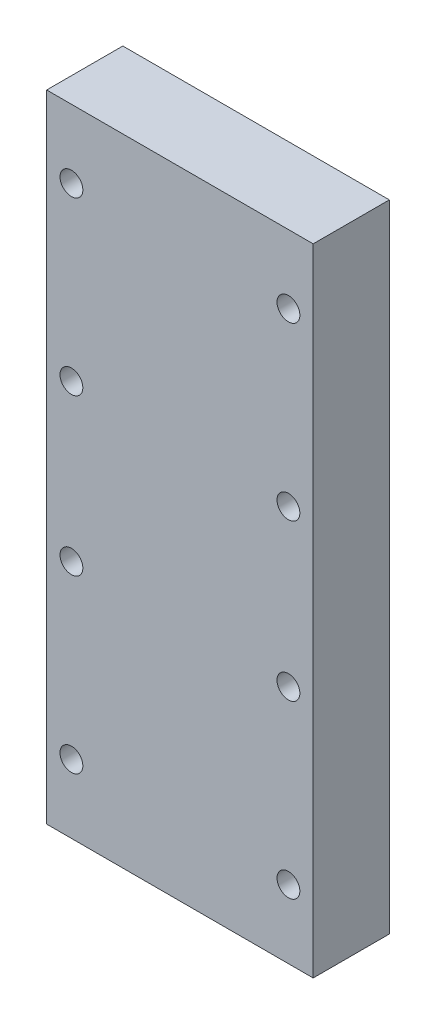
ISO-10303-21;
HEADER;
FILE_DESCRIPTION(('STEP AP214'),'2;1');
FILE_NAME('part.step','',(''),(''),'','','');
FILE_SCHEMA(('AUTOMOTIVE_DESIGN { 1 0 10303 214 1 1 1 1 }'));
ENDSEC;
DATA;
#1=APPLICATION_CONTEXT('core data for automotive mechanical design processes');
#2=APPLICATION_PROTOCOL_DEFINITION('international standard','automotive_design',2000,#1);
#3=PRODUCT_CONTEXT('',#1,'mechanical');
#4=PRODUCT('Part','Part','',(#3));
#5=PRODUCT_RELATED_PRODUCT_CATEGORY('part','',(#4));
#6=PRODUCT_DEFINITION_FORMATION('','',#4);
#7=PRODUCT_DEFINITION_CONTEXT('part definition',#1,'design');
#8=PRODUCT_DEFINITION('design','',#6,#7);
#9=PRODUCT_DEFINITION_SHAPE('','',#8);
#10=(LENGTH_UNIT() NAMED_UNIT(*) SI_UNIT(.MILLI.,.METRE.));
#11=(NAMED_UNIT(*) PLANE_ANGLE_UNIT() SI_UNIT($,.RADIAN.));
#12=(NAMED_UNIT(*) SI_UNIT($,.STERADIAN.) SOLID_ANGLE_UNIT());
#13=UNCERTAINTY_MEASURE_WITH_UNIT(LENGTH_MEASURE(1.E-05),#10,'distance_accuracy_value','');
#14=(GEOMETRIC_REPRESENTATION_CONTEXT(3) GLOBAL_UNCERTAINTY_ASSIGNED_CONTEXT((#13)) GLOBAL_UNIT_ASSIGNED_CONTEXT((#10,
#11,#12)) REPRESENTATION_CONTEXT('',''));
#15=CARTESIAN_POINT('',(0.,0.,0.));
#16=DIRECTION('',(0.,0.,1.));
#17=DIRECTION('',(1.,0.,0.));
#18=AXIS2_PLACEMENT_3D('',#15,#16,#17);
#19=CARTESIAN_POINT('',(-35.,-83.5,20.));
#20=DIRECTION('',(1.,0.,0.));
#21=DIRECTION('',(0.,0.,-1.));
#22=AXIS2_PLACEMENT_3D('',#19,#20,#21);
#23=PLANE('',#22);
#24=DIRECTION('',(0.,-1.,0.));
#25=VECTOR('',#24,1.);
#26=CARTESIAN_POINT('',(-35.,-83.5,0.));
#27=LINE('',#26,#25);
#28=CARTESIAN_POINT('',(-35.,83.5,0.));
#29=VERTEX_POINT('',#28);
#30=CARTESIAN_POINT('',(-35.,-83.5,0.));
#31=VERTEX_POINT('',#30);
#32=EDGE_CURVE('E96',#29,#31,#27,.T.);
#33=ORIENTED_EDGE('',*,*,#32,.T.);
#34=DIRECTION('',(0.,0.,-1.));
#35=VECTOR('',#34,1.);
#36=CARTESIAN_POINT('',(-35.,-83.5,20.));
#37=LINE('',#36,#35);
#38=CARTESIAN_POINT('',(-35.,-83.5,20.));
#39=VERTEX_POINT('',#38);
#40=EDGE_CURVE('E11',#39,#31,#37,.T.);
#41=ORIENTED_EDGE('',*,*,#40,.F.);
#42=DIRECTION('',(0.,-1.,0.));
#43=VECTOR('',#42,1.);
#44=CARTESIAN_POINT('',(-35.,-83.5,20.));
#45=LINE('',#44,#43);
#46=CARTESIAN_POINT('',(-35.,83.5,20.));
#47=VERTEX_POINT('',#46);
#48=EDGE_CURVE('E84',#47,#39,#45,.T.);
#49=ORIENTED_EDGE('',*,*,#48,.F.);
#50=DIRECTION('',(0.,0.,-1.));
#51=VECTOR('',#50,1.);
#52=CARTESIAN_POINT('',(-35.,83.5,20.));
#53=LINE('',#52,#51);
#54=EDGE_CURVE('E92',#47,#29,#53,.T.);
#55=ORIENTED_EDGE('',*,*,#54,.T.);
#56=EDGE_LOOP('',(#33,#41,#49,#55));
#57=FACE_BOUND('',#56,.T.);
#58=ADVANCED_FACE('F33',(#57),#23,.F.);
#59=CARTESIAN_POINT('',(35.,-83.5,20.));
#60=DIRECTION('',(0.,1.,0.));
#61=DIRECTION('',(0.,0.,1.));
#62=AXIS2_PLACEMENT_3D('',#59,#60,#61);
#63=PLANE('',#62);
#64=DIRECTION('',(1.,0.,0.));
#65=VECTOR('',#64,1.);
#66=CARTESIAN_POINT('',(35.,-83.5,0.));
#67=LINE('',#66,#65);
#68=CARTESIAN_POINT('',(35.,-83.5,0.));
#69=VERTEX_POINT('',#68);
#70=EDGE_CURVE('E88',#31,#69,#67,.T.);
#71=ORIENTED_EDGE('',*,*,#70,.T.);
#72=DIRECTION('',(0.,0.,-1.));
#73=VECTOR('',#72,1.);
#74=CARTESIAN_POINT('',(35.,-83.5,20.));
#75=LINE('',#74,#73);
#76=CARTESIAN_POINT('',(35.,-83.5,20.));
#77=VERTEX_POINT('',#76);
#78=EDGE_CURVE('E41',#77,#69,#75,.T.);
#79=ORIENTED_EDGE('',*,*,#78,.F.);
#80=DIRECTION('',(1.,0.,0.));
#81=VECTOR('',#80,1.);
#82=CARTESIAN_POINT('',(35.,-83.5,20.));
#83=LINE('',#82,#81);
#84=EDGE_CURVE('E79',#39,#77,#83,.T.);
#85=ORIENTED_EDGE('',*,*,#84,.F.);
#86=ORIENTED_EDGE('',*,*,#40,.T.);
#87=EDGE_LOOP('',(#71,#79,#85,#86));
#88=FACE_BOUND('',#87,.T.);
#89=ADVANCED_FACE('F87',(#88),#63,.F.);
#90=CARTESIAN_POINT('',(35.,-83.5,20.));
#91=DIRECTION('',(-1.,0.,0.));
#92=DIRECTION('',(0.,0.,1.));
#93=AXIS2_PLACEMENT_3D('',#90,#91,#92);
#94=PLANE('',#93);
#95=DIRECTION('',(0.,1.,0.));
#96=VECTOR('',#95,1.);
#97=CARTESIAN_POINT('',(35.,-83.5,0.));
#98=LINE('',#97,#96);
#99=CARTESIAN_POINT('',(35.,83.5,0.));
#100=VERTEX_POINT('',#99);
#101=EDGE_CURVE('E66',#69,#100,#98,.T.);
#102=ORIENTED_EDGE('',*,*,#101,.T.);
#103=DIRECTION('',(0.,0.,-1.));
#104=VECTOR('',#103,1.);
#105=CARTESIAN_POINT('',(35.,83.5,20.));
#106=LINE('',#105,#104);
#107=CARTESIAN_POINT('',(35.,83.5,20.));
#108=VERTEX_POINT('',#107);
#109=EDGE_CURVE('E89',#108,#100,#106,.T.);
#110=ORIENTED_EDGE('',*,*,#109,.F.);
#111=DIRECTION('',(0.,1.,0.));
#112=VECTOR('',#111,1.);
#113=CARTESIAN_POINT('',(35.,-83.5,20.));
#114=LINE('',#113,#112);
#115=EDGE_CURVE('E82',#77,#108,#114,.T.);
#116=ORIENTED_EDGE('',*,*,#115,.F.);
#117=ORIENTED_EDGE('',*,*,#78,.T.);
#118=EDGE_LOOP('',(#102,#110,#116,#117));
#119=FACE_BOUND('',#118,.T.);
#120=ADVANCED_FACE('F90',(#119),#94,.F.);
#121=CARTESIAN_POINT('',(35.,83.5,20.));
#122=DIRECTION('',(0.,-1.,0.));
#123=DIRECTION('',(0.,0.,-1.));
#124=AXIS2_PLACEMENT_3D('',#121,#122,#123);
#125=PLANE('',#124);
#126=DIRECTION('',(-1.,0.,0.));
#127=VECTOR('',#126,1.);
#128=CARTESIAN_POINT('',(35.,83.5,0.));
#129=LINE('',#128,#127);
#130=EDGE_CURVE('E72',#100,#29,#129,.T.);
#131=ORIENTED_EDGE('',*,*,#130,.T.);
#132=ORIENTED_EDGE('',*,*,#54,.F.);
#133=DIRECTION('',(-1.,0.,0.));
#134=VECTOR('',#133,1.);
#135=CARTESIAN_POINT('',(35.,83.5,20.));
#136=LINE('',#135,#134);
#137=EDGE_CURVE('E49',#108,#47,#136,.T.);
#138=ORIENTED_EDGE('',*,*,#137,.F.);
#139=ORIENTED_EDGE('',*,*,#109,.T.);
#140=EDGE_LOOP('',(#131,#132,#138,#139));
#141=FACE_BOUND('',#140,.T.);
#142=ADVANCED_FACE('F104',(#141),#125,.F.);
#143=CARTESIAN_POINT('',(0.,0.,20.));
#144=DIRECTION('',(0.,0.,1.));
#145=DIRECTION('',(1.,0.,0.));
#146=AXIS2_PLACEMENT_3D('',#143,#144,#145);
#147=PLANE('',#146);
#148=CARTESIAN_POINT('',(-28.5000000000696,-65.499999999921,20.));
#149=DIRECTION('',(0.,0.,-1.));
#150=DIRECTION('',(-1.,0.,0.));
#151=AXIS2_PLACEMENT_3D('',#148,#149,#150);
#152=CIRCLE('',#151,2.99999999999999);
#153=CARTESIAN_POINT('',(-31.5000000000696,-65.499999999921,20.));
#154=VERTEX_POINT('',#153);
#155=EDGE_CURVE('E149',#154,#154,#152,.T.);
#156=ORIENTED_EDGE('',*,*,#155,.T.);
#157=EDGE_LOOP('',(#156));
#158=FACE_BOUND('',#157,.T.);
#159=CARTESIAN_POINT('',(28.4999999999304,-65.499999999921,20.));
#160=DIRECTION('',(0.,0.,-1.));
#161=DIRECTION('',(-1.,0.,0.));
#162=AXIS2_PLACEMENT_3D('',#159,#160,#161);
#163=CIRCLE('',#162,2.99999999999999);
#164=CARTESIAN_POINT('',(25.4999999999304,-65.499999999921,20.));
#165=VERTEX_POINT('',#164);
#166=EDGE_CURVE('E143',#165,#165,#163,.T.);
#167=ORIENTED_EDGE('',*,*,#166,.T.);
#168=EDGE_LOOP('',(#167));
#169=FACE_BOUND('',#168,.T.);
#170=CARTESIAN_POINT('',(-28.5000000000691,-20.4999999999208,20.));
#171=DIRECTION('',(0.,0.,-1.));
#172=DIRECTION('',(-1.,0.,0.));
#173=AXIS2_PLACEMENT_3D('',#170,#171,#172);
#174=CIRCLE('',#173,3.);
#175=CARTESIAN_POINT('',(-31.5000000000691,-20.4999999999208,20.));
#176=VERTEX_POINT('',#175);
#177=EDGE_CURVE('E137',#176,#176,#174,.T.);
#178=ORIENTED_EDGE('',*,*,#177,.T.);
#179=EDGE_LOOP('',(#178));
#180=FACE_BOUND('',#179,.T.);
#181=CARTESIAN_POINT('',(28.4999999999308,-20.4999999999215,20.));
#182=DIRECTION('',(0.,0.,-1.));
#183=DIRECTION('',(-1.,0.,0.));
#184=AXIS2_PLACEMENT_3D('',#181,#182,#183);
#185=CIRCLE('',#184,3.);
#186=CARTESIAN_POINT('',(25.4999999999308,-20.4999999999215,20.));
#187=VERTEX_POINT('',#186);
#188=EDGE_CURVE('E131',#187,#187,#185,.T.);
#189=ORIENTED_EDGE('',*,*,#188,.T.);
#190=EDGE_LOOP('',(#189));
#191=FACE_BOUND('',#190,.T.);
#192=CARTESIAN_POINT('',(-28.5000000000496,20.5000000000216,20.));
#193=DIRECTION('',(0.,0.,-1.));
#194=DIRECTION('',(-1.,0.,0.));
#195=AXIS2_PLACEMENT_3D('',#192,#193,#194);
#196=CIRCLE('',#195,3.);
#197=CARTESIAN_POINT('',(-31.5000000000496,20.5000000000216,20.));
#198=VERTEX_POINT('',#197);
#199=EDGE_CURVE('E125',#198,#198,#196,.T.);
#200=ORIENTED_EDGE('',*,*,#199,.T.);
#201=EDGE_LOOP('',(#200));
#202=FACE_BOUND('',#201,.T.);
#203=CARTESIAN_POINT('',(28.4999999999503,20.5000000000216,20.));
#204=DIRECTION('',(0.,0.,-1.));
#205=DIRECTION('',(-1.,0.,0.));
#206=AXIS2_PLACEMENT_3D('',#203,#204,#205);
#207=CIRCLE('',#206,3.);
#208=CARTESIAN_POINT('',(25.4999999999503,20.5000000000216,20.));
#209=VERTEX_POINT('',#208);
#210=EDGE_CURVE('E119',#209,#209,#207,.T.);
#211=ORIENTED_EDGE('',*,*,#210,.T.);
#212=EDGE_LOOP('',(#211));
#213=FACE_BOUND('',#212,.T.);
#214=CARTESIAN_POINT('',(-28.5000000000491,65.5000000000213,20.));
#215=DIRECTION('',(0.,0.,-1.));
#216=DIRECTION('',(-1.,0.,0.));
#217=AXIS2_PLACEMENT_3D('',#214,#215,#216);
#218=CIRCLE('',#217,3.);
#219=CARTESIAN_POINT('',(-31.5000000000492,65.5000000000213,20.));
#220=VERTEX_POINT('',#219);
#221=EDGE_CURVE('E113',#220,#220,#218,.T.);
#222=ORIENTED_EDGE('',*,*,#221,.T.);
#223=EDGE_LOOP('',(#222));
#224=FACE_BOUND('',#223,.T.);
#225=CARTESIAN_POINT('',(28.4999999999508,65.5000000000218,20.));
#226=DIRECTION('',(0.,0.,-1.));
#227=DIRECTION('',(-1.,0.,0.));
#228=AXIS2_PLACEMENT_3D('',#225,#226,#227);
#229=CIRCLE('',#228,3.);
#230=CARTESIAN_POINT('',(25.4999999999508,65.5000000000218,20.));
#231=VERTEX_POINT('',#230);
#232=EDGE_CURVE('E99',#231,#231,#229,.T.);
#233=ORIENTED_EDGE('',*,*,#232,.T.);
#234=EDGE_LOOP('',(#233));
#235=FACE_BOUND('',#234,.T.);
#236=ORIENTED_EDGE('',*,*,#48,.T.);
#237=ORIENTED_EDGE('',*,*,#84,.T.);
#238=ORIENTED_EDGE('',*,*,#115,.T.);
#239=ORIENTED_EDGE('',*,*,#137,.T.);
#240=EDGE_LOOP('',(#236,#237,#238,#239));
#241=FACE_BOUND('',#240,.T.);
#242=ADVANCED_FACE('F80',(#158,#169,#180,#191,#202,#213,#224,#235,#241),#147,.T.);
#243=CARTESIAN_POINT('',(0.,0.,0.));
#244=DIRECTION('',(0.,0.,1.));
#245=DIRECTION('',(1.,0.,0.));
#246=AXIS2_PLACEMENT_3D('',#243,#244,#245);
#247=PLANE('',#246);
#248=CARTESIAN_POINT('',(-28.5000000000696,-65.499999999921,0.));
#249=DIRECTION('',(0.,0.,-1.));
#250=DIRECTION('',(-1.,0.,0.));
#251=AXIS2_PLACEMENT_3D('',#248,#249,#250);
#252=CIRCLE('',#251,2.99999999999999);
#253=CARTESIAN_POINT('',(-31.5000000000696,-65.499999999921,0.));
#254=VERTEX_POINT('',#253);
#255=EDGE_CURVE('E152',#254,#254,#252,.T.);
#256=ORIENTED_EDGE('',*,*,#255,.F.);
#257=EDGE_LOOP('',(#256));
#258=FACE_BOUND('',#257,.T.);
#259=CARTESIAN_POINT('',(28.4999999999304,-65.499999999921,0.));
#260=DIRECTION('',(0.,0.,-1.));
#261=DIRECTION('',(-1.,0.,0.));
#262=AXIS2_PLACEMENT_3D('',#259,#260,#261);
#263=CIRCLE('',#262,2.99999999999999);
#264=CARTESIAN_POINT('',(25.4999999999304,-65.499999999921,0.));
#265=VERTEX_POINT('',#264);
#266=EDGE_CURVE('E146',#265,#265,#263,.T.);
#267=ORIENTED_EDGE('',*,*,#266,.F.);
#268=EDGE_LOOP('',(#267));
#269=FACE_BOUND('',#268,.T.);
#270=CARTESIAN_POINT('',(-28.5000000000691,-20.4999999999208,0.));
#271=DIRECTION('',(0.,0.,-1.));
#272=DIRECTION('',(-1.,0.,0.));
#273=AXIS2_PLACEMENT_3D('',#270,#271,#272);
#274=CIRCLE('',#273,3.);
#275=CARTESIAN_POINT('',(-31.5000000000691,-20.4999999999208,0.));
#276=VERTEX_POINT('',#275);
#277=EDGE_CURVE('E140',#276,#276,#274,.T.);
#278=ORIENTED_EDGE('',*,*,#277,.F.);
#279=EDGE_LOOP('',(#278));
#280=FACE_BOUND('',#279,.T.);
#281=CARTESIAN_POINT('',(28.4999999999308,-20.4999999999215,0.));
#282=DIRECTION('',(0.,0.,-1.));
#283=DIRECTION('',(-1.,0.,0.));
#284=AXIS2_PLACEMENT_3D('',#281,#282,#283);
#285=CIRCLE('',#284,3.);
#286=CARTESIAN_POINT('',(25.4999999999308,-20.4999999999215,0.));
#287=VERTEX_POINT('',#286);
#288=EDGE_CURVE('E134',#287,#287,#285,.T.);
#289=ORIENTED_EDGE('',*,*,#288,.F.);
#290=EDGE_LOOP('',(#289));
#291=FACE_BOUND('',#290,.T.);
#292=CARTESIAN_POINT('',(-28.5000000000496,20.5000000000216,0.));
#293=DIRECTION('',(0.,0.,-1.));
#294=DIRECTION('',(-1.,0.,0.));
#295=AXIS2_PLACEMENT_3D('',#292,#293,#294);
#296=CIRCLE('',#295,3.);
#297=CARTESIAN_POINT('',(-31.5000000000496,20.5000000000216,0.));
#298=VERTEX_POINT('',#297);
#299=EDGE_CURVE('E128',#298,#298,#296,.T.);
#300=ORIENTED_EDGE('',*,*,#299,.F.);
#301=EDGE_LOOP('',(#300));
#302=FACE_BOUND('',#301,.T.);
#303=CARTESIAN_POINT('',(28.4999999999503,20.5000000000216,0.));
#304=DIRECTION('',(0.,0.,-1.));
#305=DIRECTION('',(-1.,0.,0.));
#306=AXIS2_PLACEMENT_3D('',#303,#304,#305);
#307=CIRCLE('',#306,3.);
#308=CARTESIAN_POINT('',(25.4999999999503,20.5000000000216,0.));
#309=VERTEX_POINT('',#308);
#310=EDGE_CURVE('E122',#309,#309,#307,.T.);
#311=ORIENTED_EDGE('',*,*,#310,.F.);
#312=EDGE_LOOP('',(#311));
#313=FACE_BOUND('',#312,.T.);
#314=CARTESIAN_POINT('',(-28.5000000000491,65.5000000000213,0.));
#315=DIRECTION('',(0.,0.,-1.));
#316=DIRECTION('',(-1.,0.,0.));
#317=AXIS2_PLACEMENT_3D('',#314,#315,#316);
#318=CIRCLE('',#317,3.);
#319=CARTESIAN_POINT('',(-31.5000000000492,65.5000000000213,0.));
#320=VERTEX_POINT('',#319);
#321=EDGE_CURVE('E116',#320,#320,#318,.T.);
#322=ORIENTED_EDGE('',*,*,#321,.F.);
#323=EDGE_LOOP('',(#322));
#324=FACE_BOUND('',#323,.T.);
#325=CARTESIAN_POINT('',(28.4999999999508,65.5000000000218,0.));
#326=DIRECTION('',(0.,0.,-1.));
#327=DIRECTION('',(-1.,0.,0.));
#328=AXIS2_PLACEMENT_3D('',#325,#326,#327);
#329=CIRCLE('',#328,3.);
#330=CARTESIAN_POINT('',(25.4999999999508,65.5000000000218,0.));
#331=VERTEX_POINT('',#330);
#332=EDGE_CURVE('E110',#331,#331,#329,.T.);
#333=ORIENTED_EDGE('',*,*,#332,.F.);
#334=EDGE_LOOP('',(#333));
#335=FACE_BOUND('',#334,.T.);
#336=ORIENTED_EDGE('',*,*,#32,.F.);
#337=ORIENTED_EDGE('',*,*,#130,.F.);
#338=ORIENTED_EDGE('',*,*,#101,.F.);
#339=ORIENTED_EDGE('',*,*,#70,.F.);
#340=EDGE_LOOP('',(#336,#337,#338,#339));
#341=FACE_BOUND('',#340,.T.);
#342=ADVANCED_FACE('F107',(#258,#269,#280,#291,#302,#313,#324,#335,#341),#247,.F.);
#343=CARTESIAN_POINT('',(28.4999999999508,65.5000000000218,20.));
#344=DIRECTION('',(0.,0.,-1.));
#345=DIRECTION('',(-1.,0.,0.));
#346=AXIS2_PLACEMENT_3D('',#343,#344,#345);
#347=CYLINDRICAL_SURFACE('',#346,3.);
#348=ORIENTED_EDGE('',*,*,#232,.F.);
#349=EDGE_LOOP('',(#348));
#350=FACE_BOUND('',#349,.T.);
#351=ORIENTED_EDGE('',*,*,#332,.T.);
#352=EDGE_LOOP('',(#351));
#353=FACE_BOUND('',#352,.T.);
#354=ADVANCED_FACE('F169',(#350,#353),#347,.F.);
#355=CARTESIAN_POINT('',(-28.5000000000491,65.5000000000213,20.));
#356=DIRECTION('',(0.,0.,-1.));
#357=DIRECTION('',(-1.,0.,0.));
#358=AXIS2_PLACEMENT_3D('',#355,#356,#357);
#359=CYLINDRICAL_SURFACE('',#358,3.);
#360=ORIENTED_EDGE('',*,*,#221,.F.);
#361=EDGE_LOOP('',(#360));
#362=FACE_BOUND('',#361,.T.);
#363=ORIENTED_EDGE('',*,*,#321,.T.);
#364=EDGE_LOOP('',(#363));
#365=FACE_BOUND('',#364,.T.);
#366=ADVANCED_FACE('F186',(#362,#365),#359,.F.);
#367=CARTESIAN_POINT('',(28.4999999999503,20.5000000000216,20.));
#368=DIRECTION('',(0.,0.,-1.));
#369=DIRECTION('',(-1.,0.,0.));
#370=AXIS2_PLACEMENT_3D('',#367,#368,#369);
#371=CYLINDRICAL_SURFACE('',#370,3.);
#372=ORIENTED_EDGE('',*,*,#210,.F.);
#373=EDGE_LOOP('',(#372));
#374=FACE_BOUND('',#373,.T.);
#375=ORIENTED_EDGE('',*,*,#310,.T.);
#376=EDGE_LOOP('',(#375));
#377=FACE_BOUND('',#376,.T.);
#378=ADVANCED_FACE('F193',(#374,#377),#371,.F.);
#379=CARTESIAN_POINT('',(-28.5000000000496,20.5000000000216,20.));
#380=DIRECTION('',(0.,0.,-1.));
#381=DIRECTION('',(-1.,0.,0.));
#382=AXIS2_PLACEMENT_3D('',#379,#380,#381);
#383=CYLINDRICAL_SURFACE('',#382,3.);
#384=ORIENTED_EDGE('',*,*,#199,.F.);
#385=EDGE_LOOP('',(#384));
#386=FACE_BOUND('',#385,.T.);
#387=ORIENTED_EDGE('',*,*,#299,.T.);
#388=EDGE_LOOP('',(#387));
#389=FACE_BOUND('',#388,.T.);
#390=ADVANCED_FACE('F235',(#386,#389),#383,.F.);
#391=CARTESIAN_POINT('',(28.4999999999308,-20.4999999999215,20.));
#392=DIRECTION('',(0.,0.,-1.));
#393=DIRECTION('',(-1.,0.,0.));
#394=AXIS2_PLACEMENT_3D('',#391,#392,#393);
#395=CYLINDRICAL_SURFACE('',#394,3.);
#396=ORIENTED_EDGE('',*,*,#188,.F.);
#397=EDGE_LOOP('',(#396));
#398=FACE_BOUND('',#397,.T.);
#399=ORIENTED_EDGE('',*,*,#288,.T.);
#400=EDGE_LOOP('',(#399));
#401=FACE_BOUND('',#400,.T.);
#402=ADVANCED_FACE('F245',(#398,#401),#395,.F.);
#403=CARTESIAN_POINT('',(-28.5000000000691,-20.4999999999208,20.));
#404=DIRECTION('',(0.,0.,-1.));
#405=DIRECTION('',(-1.,0.,0.));
#406=AXIS2_PLACEMENT_3D('',#403,#404,#405);
#407=CYLINDRICAL_SURFACE('',#406,3.);
#408=ORIENTED_EDGE('',*,*,#177,.F.);
#409=EDGE_LOOP('',(#408));
#410=FACE_BOUND('',#409,.T.);
#411=ORIENTED_EDGE('',*,*,#277,.T.);
#412=EDGE_LOOP('',(#411));
#413=FACE_BOUND('',#412,.T.);
#414=ADVANCED_FACE('F255',(#410,#413),#407,.F.);
#415=CARTESIAN_POINT('',(28.4999999999304,-65.499999999921,20.));
#416=DIRECTION('',(0.,0.,-1.));
#417=DIRECTION('',(-1.,0.,0.));
#418=AXIS2_PLACEMENT_3D('',#415,#416,#417);
#419=CYLINDRICAL_SURFACE('',#418,2.99999999999999);
#420=ORIENTED_EDGE('',*,*,#166,.F.);
#421=EDGE_LOOP('',(#420));
#422=FACE_BOUND('',#421,.T.);
#423=ORIENTED_EDGE('',*,*,#266,.T.);
#424=EDGE_LOOP('',(#423));
#425=FACE_BOUND('',#424,.T.);
#426=ADVANCED_FACE('F163',(#422,#425),#419,.F.);
#427=CARTESIAN_POINT('',(-28.5000000000696,-65.499999999921,20.));
#428=DIRECTION('',(0.,0.,-1.));
#429=DIRECTION('',(-1.,0.,0.));
#430=AXIS2_PLACEMENT_3D('',#427,#428,#429);
#431=CYLINDRICAL_SURFACE('',#430,2.99999999999999);
#432=ORIENTED_EDGE('',*,*,#155,.F.);
#433=EDGE_LOOP('',(#432));
#434=FACE_BOUND('',#433,.T.);
#435=ORIENTED_EDGE('',*,*,#255,.T.);
#436=EDGE_LOOP('',(#435));
#437=FACE_BOUND('',#436,.T.);
#438=ADVANCED_FACE('F160',(#434,#437),#431,.F.);
#439=CLOSED_SHELL('',(#58,#89,#120,#142,#242,#342,#354,#366,#378,#390,#402,#414,#426,#438));
#440=MANIFOLD_SOLID_BREP('B2',#439);
#441=ADVANCED_BREP_SHAPE_REPRESENTATION('',(#18,#440),#14);
#442=SHAPE_DEFINITION_REPRESENTATION(#9,#441);
ENDSEC;
END-ISO-10303-21;
